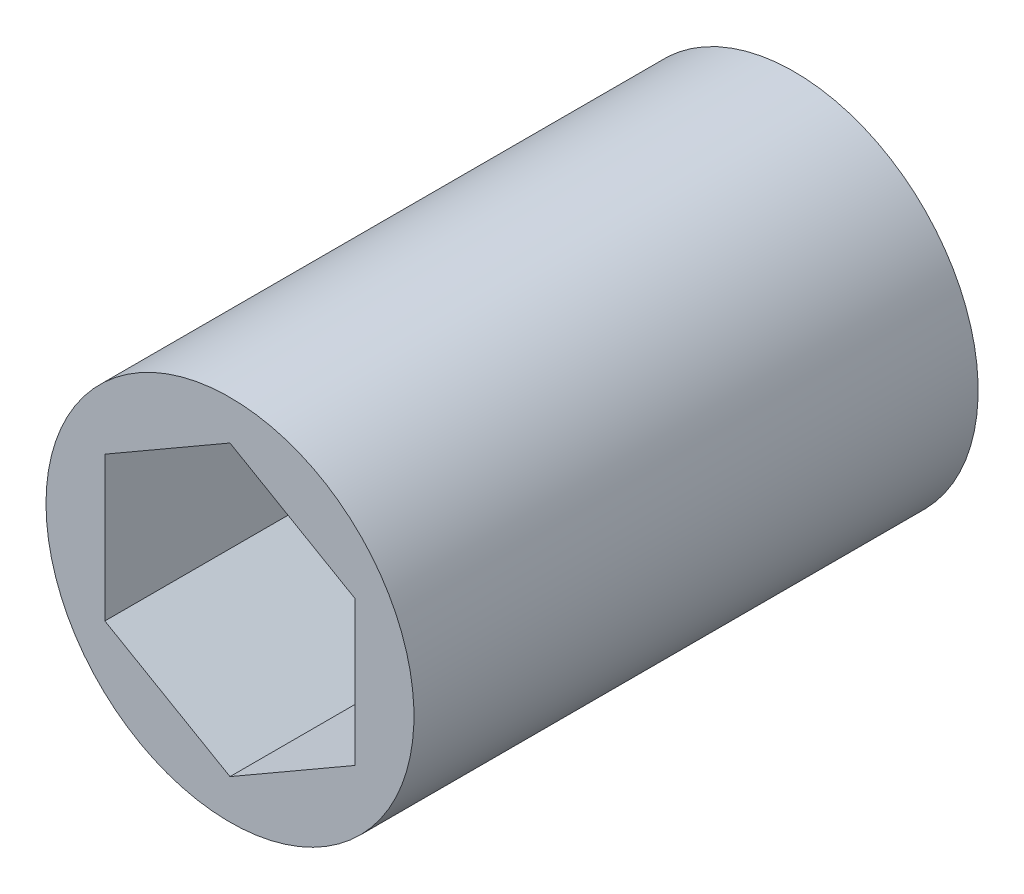
ISO-10303-21;
HEADER;
FILE_DESCRIPTION(('STEP AP214'),'2;1');
FILE_NAME('part.step','',(''),(''),'','','');
FILE_SCHEMA(('AUTOMOTIVE_DESIGN { 1 0 10303 214 1 1 1 1 }'));
ENDSEC;
DATA;
#1=APPLICATION_CONTEXT('core data for automotive mechanical design processes');
#2=APPLICATION_PROTOCOL_DEFINITION('international standard','automotive_design',2000,#1);
#3=PRODUCT_CONTEXT('',#1,'mechanical');
#4=PRODUCT('Part','Part','',(#3));
#5=PRODUCT_RELATED_PRODUCT_CATEGORY('part','',(#4));
#6=PRODUCT_DEFINITION_FORMATION('','',#4);
#7=PRODUCT_DEFINITION_CONTEXT('part definition',#1,'design');
#8=PRODUCT_DEFINITION('design','',#6,#7);
#9=PRODUCT_DEFINITION_SHAPE('','',#8);
#10=(LENGTH_UNIT() NAMED_UNIT(*) SI_UNIT(.MILLI.,.METRE.));
#11=(NAMED_UNIT(*) PLANE_ANGLE_UNIT() SI_UNIT($,.RADIAN.));
#12=(NAMED_UNIT(*) SI_UNIT($,.STERADIAN.) SOLID_ANGLE_UNIT());
#13=UNCERTAINTY_MEASURE_WITH_UNIT(LENGTH_MEASURE(1.E-05),#10,'distance_accuracy_value','');
#14=(GEOMETRIC_REPRESENTATION_CONTEXT(3) GLOBAL_UNCERTAINTY_ASSIGNED_CONTEXT((#13)) GLOBAL_UNIT_ASSIGNED_CONTEXT((#10,
#11,#12)) REPRESENTATION_CONTEXT('',''));
#15=CARTESIAN_POINT('',(0.,0.,0.));
#16=DIRECTION('',(0.,0.,1.));
#17=DIRECTION('',(1.,0.,0.));
#18=AXIS2_PLACEMENT_3D('',#15,#16,#17);
#19=CARTESIAN_POINT('',(0.,0.,14.605));
#20=DIRECTION('',(0.,0.,1.));
#21=DIRECTION('',(1.,0.,0.));
#22=AXIS2_PLACEMENT_3D('',#19,#20,#21);
#23=PLANE('',#22);
#24=CARTESIAN_POINT('',(0.,0.,14.605));
#25=DIRECTION('',(0.,0.,1.));
#26=DIRECTION('',(1.,0.,0.));
#27=AXIS2_PLACEMENT_3D('',#24,#25,#26);
#28=CIRCLE('',#27,9.525);
#29=CARTESIAN_POINT('',(-9.525,0.,14.605));
#30=VERTEX_POINT('',#29);
#31=EDGE_CURVE('E11',#30,#30,#28,.T.);
#32=ORIENTED_EDGE('',*,*,#31,.T.);
#33=EDGE_LOOP('',(#32));
#34=FACE_BOUND('',#33,.T.);
#35=DIRECTION('',(-0.866025403784439,-0.5,0.));
#36=VECTOR('',#35,1.);
#37=CARTESIAN_POINT('',(0.,7.47899538708241,14.605));
#38=LINE('',#37,#36);
#39=CARTESIAN_POINT('',(0.,7.47899538708241,14.605));
#40=VERTEX_POINT('',#39);
#41=CARTESIAN_POINT('',(-6.477,3.73949769354121,14.605));
#42=VERTEX_POINT('',#41);
#43=EDGE_CURVE('E108',#40,#42,#38,.T.);
#44=ORIENTED_EDGE('',*,*,#43,.F.);
#45=DIRECTION('',(-0.866025403784439,0.5,0.));
#46=VECTOR('',#45,1.);
#47=CARTESIAN_POINT('',(6.477,3.73949769354121,14.605));
#48=LINE('',#47,#46);
#49=CARTESIAN_POINT('',(6.477,3.73949769354121,14.605));
#50=VERTEX_POINT('',#49);
#51=EDGE_CURVE('E99',#50,#40,#48,.T.);
#52=ORIENTED_EDGE('',*,*,#51,.F.);
#53=DIRECTION('',(0.,1.,0.));
#54=VECTOR('',#53,1.);
#55=CARTESIAN_POINT('',(6.477,-3.73949769354121,14.605));
#56=LINE('',#55,#54);
#57=CARTESIAN_POINT('',(6.477,-3.73949769354121,14.605));
#58=VERTEX_POINT('',#57);
#59=EDGE_CURVE('E133',#58,#50,#56,.T.);
#60=ORIENTED_EDGE('',*,*,#59,.F.);
#61=DIRECTION('',(0.866025403784439,0.5,0.));
#62=VECTOR('',#61,1.);
#63=CARTESIAN_POINT('',(0.,-7.47899538708241,14.605));
#64=LINE('',#63,#62);
#65=CARTESIAN_POINT('',(0.,-7.47899538708241,14.605));
#66=VERTEX_POINT('',#65);
#67=EDGE_CURVE('E130',#66,#58,#64,.T.);
#68=ORIENTED_EDGE('',*,*,#67,.F.);
#69=DIRECTION('',(0.866025403784439,-0.5,0.));
#70=VECTOR('',#69,1.);
#71=CARTESIAN_POINT('',(-6.477,-3.73949769354121,14.605));
#72=LINE('',#71,#70);
#73=CARTESIAN_POINT('',(-6.477,-3.73949769354121,14.605));
#74=VERTEX_POINT('',#73);
#75=EDGE_CURVE('E125',#74,#66,#72,.T.);
#76=ORIENTED_EDGE('',*,*,#75,.F.);
#77=DIRECTION('',(0.,-1.,0.));
#78=VECTOR('',#77,1.);
#79=CARTESIAN_POINT('',(-6.477,3.73949769354121,14.605));
#80=LINE('',#79,#78);
#81=EDGE_CURVE('E121',#42,#74,#80,.T.);
#82=ORIENTED_EDGE('',*,*,#81,.F.);
#83=EDGE_LOOP('',(#44,#52,#60,#68,#76,#82));
#84=FACE_BOUND('',#83,.T.);
#85=ADVANCED_FACE('F45',(#34,#84),#23,.T.);
#86=CARTESIAN_POINT('',(0.,0.,-14.605));
#87=DIRECTION('',(0.,0.,1.));
#88=DIRECTION('',(1.,0.,0.));
#89=AXIS2_PLACEMENT_3D('',#86,#87,#88);
#90=PLANE('',#89);
#91=CARTESIAN_POINT('',(0.,0.,-14.605));
#92=DIRECTION('',(0.,0.,1.));
#93=DIRECTION('',(1.,0.,0.));
#94=AXIS2_PLACEMENT_3D('',#91,#92,#93);
#95=CIRCLE('',#94,9.525);
#96=CARTESIAN_POINT('',(-9.525,0.,-14.605));
#97=VERTEX_POINT('',#96);
#98=EDGE_CURVE('E49',#97,#97,#95,.T.);
#99=ORIENTED_EDGE('',*,*,#98,.F.);
#100=EDGE_LOOP('',(#99));
#101=FACE_BOUND('',#100,.T.);
#102=DIRECTION('',(-0.866025403784439,0.5,0.));
#103=VECTOR('',#102,1.);
#104=CARTESIAN_POINT('',(6.477,3.73949769354121,-14.605));
#105=LINE('',#104,#103);
#106=CARTESIAN_POINT('',(6.477,3.73949769354121,-14.605));
#107=VERTEX_POINT('',#106);
#108=CARTESIAN_POINT('',(0.,7.47899538708241,-14.605));
#109=VERTEX_POINT('',#108);
#110=EDGE_CURVE('E69',#107,#109,#105,.T.);
#111=ORIENTED_EDGE('',*,*,#110,.T.);
#112=DIRECTION('',(-0.866025403784439,-0.5,0.));
#113=VECTOR('',#112,1.);
#114=CARTESIAN_POINT('',(0.,7.47899538708241,-14.605));
#115=LINE('',#114,#113);
#116=CARTESIAN_POINT('',(-6.477,3.73949769354121,-14.605));
#117=VERTEX_POINT('',#116);
#118=EDGE_CURVE('E115',#109,#117,#115,.T.);
#119=ORIENTED_EDGE('',*,*,#118,.T.);
#120=DIRECTION('',(0.,-1.,0.));
#121=VECTOR('',#120,1.);
#122=CARTESIAN_POINT('',(-6.477,3.73949769354121,-14.605));
#123=LINE('',#122,#121);
#124=CARTESIAN_POINT('',(-6.477,-3.73949769354121,-14.605));
#125=VERTEX_POINT('',#124);
#126=EDGE_CURVE('E140',#117,#125,#123,.T.);
#127=ORIENTED_EDGE('',*,*,#126,.T.);
#128=DIRECTION('',(0.866025403784439,-0.5,0.));
#129=VECTOR('',#128,1.);
#130=CARTESIAN_POINT('',(-6.477,-3.73949769354121,-14.605));
#131=LINE('',#130,#129);
#132=CARTESIAN_POINT('',(0.,-7.47899538708241,-14.605));
#133=VERTEX_POINT('',#132);
#134=EDGE_CURVE('E144',#125,#133,#131,.T.);
#135=ORIENTED_EDGE('',*,*,#134,.T.);
#136=DIRECTION('',(0.866025403784439,0.5,0.));
#137=VECTOR('',#136,1.);
#138=CARTESIAN_POINT('',(0.,-7.47899538708241,-14.605));
#139=LINE('',#138,#137);
#140=CARTESIAN_POINT('',(6.477,-3.73949769354121,-14.605));
#141=VERTEX_POINT('',#140);
#142=EDGE_CURVE('E148',#133,#141,#139,.T.);
#143=ORIENTED_EDGE('',*,*,#142,.T.);
#144=DIRECTION('',(0.,1.,0.));
#145=VECTOR('',#144,1.);
#146=CARTESIAN_POINT('',(6.477,-3.73949769354121,-14.605));
#147=LINE('',#146,#145);
#148=EDGE_CURVE('E109',#141,#107,#147,.T.);
#149=ORIENTED_EDGE('',*,*,#148,.T.);
#150=EDGE_LOOP('',(#111,#119,#127,#135,#143,#149));
#151=FACE_BOUND('',#150,.T.);
#152=ADVANCED_FACE('F172',(#101,#151),#90,.F.);
#153=CARTESIAN_POINT('',(0.,0.,14.605));
#154=DIRECTION('',(0.,0.,-1.));
#155=DIRECTION('',(-1.,0.,0.));
#156=AXIS2_PLACEMENT_3D('',#153,#154,#155);
#157=CYLINDRICAL_SURFACE('',#156,9.525);
#158=CARTESIAN_POINT('',(-9.525,0.,14.605));
#159=CARTESIAN_POINT('',(-9.525,0.,14.3007291666667));
#160=CARTESIAN_POINT('',(-9.525,0.,13.9964583333333));
#161=CARTESIAN_POINT('',(-9.525,0.,13.3879166666667));
#162=CARTESIAN_POINT('',(-9.525,0.,13.0836458333333));
#163=CARTESIAN_POINT('',(-9.525,0.,12.4751041666667));
#164=CARTESIAN_POINT('',(-9.525,0.,12.1708333333333));
#165=CARTESIAN_POINT('',(-9.525,0.,11.5622916666667));
#166=CARTESIAN_POINT('',(-9.525,0.,11.2580208333333));
#167=CARTESIAN_POINT('',(-9.525,0.,10.6494791666667));
#168=CARTESIAN_POINT('',(-9.525,0.,10.3452083333333));
#169=CARTESIAN_POINT('',(-9.525,0.,9.73666666666666));
#170=CARTESIAN_POINT('',(-9.525,0.,9.43239583333333));
#171=CARTESIAN_POINT('',(-9.525,0.,8.82385416666666));
#172=CARTESIAN_POINT('',(-9.525,0.,8.51958333333333));
#173=CARTESIAN_POINT('',(-9.525,0.,7.91104166666666));
#174=CARTESIAN_POINT('',(-9.525,0.,7.60677083333333));
#175=CARTESIAN_POINT('',(-9.525,0.,6.99822916666666));
#176=CARTESIAN_POINT('',(-9.525,0.,6.69395833333333));
#177=CARTESIAN_POINT('',(-9.525,0.,6.08541666666666));
#178=CARTESIAN_POINT('',(-9.525,0.,5.78114583333333));
#179=CARTESIAN_POINT('',(-9.525,0.,5.17260416666667));
#180=CARTESIAN_POINT('',(-9.525,0.,4.86833333333333));
#181=CARTESIAN_POINT('',(-9.525,0.,4.25979166666666));
#182=CARTESIAN_POINT('',(-9.525,0.,3.95552083333333));
#183=CARTESIAN_POINT('',(-9.525,0.,3.34697916666666));
#184=CARTESIAN_POINT('',(-9.525,0.,3.04270833333333));
#185=CARTESIAN_POINT('',(-9.525,0.,2.43416666666667));
#186=CARTESIAN_POINT('',(-9.525,0.,2.12989583333333));
#187=CARTESIAN_POINT('',(-9.525,0.,1.52135416666667));
#188=CARTESIAN_POINT('',(-9.525,0.,1.21708333333333));
#189=CARTESIAN_POINT('',(-9.525,0.,0.608541666666665));
#190=CARTESIAN_POINT('',(-9.525,0.,0.304270833333332));
#191=CARTESIAN_POINT('',(-9.525,0.,-0.304270833333335));
#192=CARTESIAN_POINT('',(-9.525,0.,-0.608541666666669));
#193=CARTESIAN_POINT('',(-9.525,0.,-1.21708333333333));
#194=CARTESIAN_POINT('',(-9.525,0.,-1.52135416666667));
#195=CARTESIAN_POINT('',(-9.525,0.,-2.12989583333333));
#196=CARTESIAN_POINT('',(-9.525,0.,-2.43416666666666));
#197=CARTESIAN_POINT('',(-9.525,0.,-3.04270833333333));
#198=CARTESIAN_POINT('',(-9.525,0.,-3.34697916666667));
#199=CARTESIAN_POINT('',(-9.525,0.,-3.95552083333333));
#200=CARTESIAN_POINT('',(-9.525,0.,-4.25979166666667));
#201=CARTESIAN_POINT('',(-9.525,0.,-4.86833333333333));
#202=CARTESIAN_POINT('',(-9.525,0.,-5.17260416666667));
#203=CARTESIAN_POINT('',(-9.525,0.,-5.78114583333333));
#204=CARTESIAN_POINT('',(-9.525,0.,-6.08541666666667));
#205=CARTESIAN_POINT('',(-9.525,0.,-6.69395833333333));
#206=CARTESIAN_POINT('',(-9.525,0.,-6.99822916666667));
#207=CARTESIAN_POINT('',(-9.525,0.,-7.60677083333333));
#208=CARTESIAN_POINT('',(-9.525,0.,-7.91104166666666));
#209=CARTESIAN_POINT('',(-9.525,0.,-8.51958333333333));
#210=CARTESIAN_POINT('',(-9.525,0.,-8.82385416666667));
#211=CARTESIAN_POINT('',(-9.525,0.,-9.43239583333333));
#212=CARTESIAN_POINT('',(-9.525,0.,-9.73666666666666));
#213=CARTESIAN_POINT('',(-9.525,0.,-10.3452083333333));
#214=CARTESIAN_POINT('',(-9.525,0.,-10.6494791666667));
#215=CARTESIAN_POINT('',(-9.525,0.,-11.2580208333333));
#216=CARTESIAN_POINT('',(-9.525,0.,-11.5622916666667));
#217=CARTESIAN_POINT('',(-9.525,0.,-12.1708333333333));
#218=CARTESIAN_POINT('',(-9.525,0.,-12.4751041666667));
#219=CARTESIAN_POINT('',(-9.525,0.,-13.0836458333333));
#220=CARTESIAN_POINT('',(-9.525,0.,-13.3879166666667));
#221=CARTESIAN_POINT('',(-9.525,0.,-13.9964583333333));
#222=CARTESIAN_POINT('',(-9.525,0.,-14.3007291666667));
#223=CARTESIAN_POINT('',(-9.525,0.,-14.605));
#224=B_SPLINE_CURVE_WITH_KNOTS('',3,(#158,#159,#160,#161,#162,#163,#164,#165,#166,#167,#168,
#169,#170,#171,#172,#173,#174,#175,#176,#177,#178,#179,#180,#181,#182,#183,#184,#185,#186,#187,
#188,#189,#190,#191,#192,#193,#194,#195,#196,#197,#198,#199,#200,#201,#202,#203,#204,#205,#206,
#207,#208,#209,#210,#211,#212,#213,#214,#215,#216,#217,#218,#219,#220,#221,#222,#223),
.UNSPECIFIED.,.F.,.F.,(4,2,2,2,2,2,2,2,2,2,2,2,2,2,2,2,2,2,2,2,2,2,2,2,2,2,2,2,2,2,2,2,4),(0.,
0.912812499999999,1.825625,2.7384375,3.65125,4.5640625,5.476875,6.3896875,7.3025,8.2153125,
9.128125,10.0409375,10.95375,11.8665625,12.779375,13.6921875,14.605,15.5178125,16.430625,
17.3434375,18.25625,19.1690625,20.081875,20.9946875,21.9075,22.8203125,23.733125,24.6459375,
25.55875,26.4715625,27.384375,28.2971875,29.21),.UNSPECIFIED.);
#225=EDGE_CURVE('BSEAM47',#30,#97,#224,.T.);
#226=ORIENTED_EDGE('',*,*,#31,.F.);
#227=ORIENTED_EDGE('',*,*,#98,.T.);
#228=ORIENTED_EDGE('',*,*,#225,.T.);
#229=ORIENTED_EDGE('',*,*,#225,.F.);
#230=EDGE_LOOP('',(#226,#228,#227,#229));
#231=FACE_BOUND('',#230,.T.);
#232=ADVANCED_FACE('F47',(#231),#157,.T.);
#233=CARTESIAN_POINT('',(6.477,3.73949769354121,14.605));
#234=DIRECTION('',(-0.5,-0.866025403784439,0.));
#235=DIRECTION('',(0.866025403784439,-0.5,0.));
#236=AXIS2_PLACEMENT_3D('',#233,#234,#235);
#237=PLANE('',#236);
#238=ORIENTED_EDGE('',*,*,#110,.F.);
#239=DIRECTION('',(0.,0.,-1.));
#240=VECTOR('',#239,1.);
#241=CARTESIAN_POINT('',(6.477,3.73949769354121,14.605));
#242=LINE('',#241,#240);
#243=EDGE_CURVE('E103',#50,#107,#242,.T.);
#244=ORIENTED_EDGE('',*,*,#243,.F.);
#245=ORIENTED_EDGE('',*,*,#51,.T.);
#246=DIRECTION('',(0.,0.,-1.));
#247=VECTOR('',#246,1.);
#248=CARTESIAN_POINT('',(0.,7.47899538708241,14.605));
#249=LINE('',#248,#247);
#250=EDGE_CURVE('E102',#40,#109,#249,.T.);
#251=ORIENTED_EDGE('',*,*,#250,.T.);
#252=EDGE_LOOP('',(#238,#244,#245,#251));
#253=FACE_BOUND('',#252,.T.);
#254=ADVANCED_FACE('F101',(#253),#237,.T.);
#255=CARTESIAN_POINT('',(0.,7.47899538708241,14.605));
#256=DIRECTION('',(0.5,-0.866025403784439,0.));
#257=DIRECTION('',(0.866025403784439,0.5,0.));
#258=AXIS2_PLACEMENT_3D('',#255,#256,#257);
#259=PLANE('',#258);
#260=ORIENTED_EDGE('',*,*,#118,.F.);
#261=ORIENTED_EDGE('',*,*,#250,.F.);
#262=ORIENTED_EDGE('',*,*,#43,.T.);
#263=DIRECTION('',(0.,0.,-1.));
#264=VECTOR('',#263,1.);
#265=CARTESIAN_POINT('',(-6.477,3.73949769354121,14.605));
#266=LINE('',#265,#264);
#267=EDGE_CURVE('E117',#42,#117,#266,.T.);
#268=ORIENTED_EDGE('',*,*,#267,.T.);
#269=EDGE_LOOP('',(#260,#261,#262,#268));
#270=FACE_BOUND('',#269,.T.);
#271=ADVANCED_FACE('F112',(#270),#259,.T.);
#272=CARTESIAN_POINT('',(-6.477,3.73949769354121,14.605));
#273=DIRECTION('',(1.,0.,0.));
#274=DIRECTION('',(0.,1.,0.));
#275=AXIS2_PLACEMENT_3D('',#272,#273,#274);
#276=PLANE('',#275);
#277=ORIENTED_EDGE('',*,*,#126,.F.);
#278=ORIENTED_EDGE('',*,*,#267,.F.);
#279=ORIENTED_EDGE('',*,*,#81,.T.);
#280=DIRECTION('',(0.,0.,-1.));
#281=VECTOR('',#280,1.);
#282=CARTESIAN_POINT('',(-6.477,-3.73949769354121,14.605));
#283=LINE('',#282,#281);
#284=EDGE_CURVE('E162',#74,#125,#283,.T.);
#285=ORIENTED_EDGE('',*,*,#284,.T.);
#286=EDGE_LOOP('',(#277,#278,#279,#285));
#287=FACE_BOUND('',#286,.T.);
#288=ADVANCED_FACE('F168',(#287),#276,.T.);
#289=CARTESIAN_POINT('',(-6.477,-3.73949769354121,14.605));
#290=DIRECTION('',(0.5,0.866025403784439,0.));
#291=DIRECTION('',(-0.866025403784439,0.5,0.));
#292=AXIS2_PLACEMENT_3D('',#289,#290,#291);
#293=PLANE('',#292);
#294=ORIENTED_EDGE('',*,*,#134,.F.);
#295=ORIENTED_EDGE('',*,*,#284,.F.);
#296=ORIENTED_EDGE('',*,*,#75,.T.);
#297=DIRECTION('',(0.,0.,-1.));
#298=VECTOR('',#297,1.);
#299=CARTESIAN_POINT('',(0.,-7.47899538708241,14.605));
#300=LINE('',#299,#298);
#301=EDGE_CURVE('E159',#66,#133,#300,.T.);
#302=ORIENTED_EDGE('',*,*,#301,.T.);
#303=EDGE_LOOP('',(#294,#295,#296,#302));
#304=FACE_BOUND('',#303,.T.);
#305=ADVANCED_FACE('F180',(#304),#293,.T.);
#306=CARTESIAN_POINT('',(0.,-7.47899538708241,14.605));
#307=DIRECTION('',(-0.5,0.866025403784439,0.));
#308=DIRECTION('',(-0.866025403784439,-0.5,0.));
#309=AXIS2_PLACEMENT_3D('',#306,#307,#308);
#310=PLANE('',#309);
#311=ORIENTED_EDGE('',*,*,#142,.F.);
#312=ORIENTED_EDGE('',*,*,#301,.F.);
#313=ORIENTED_EDGE('',*,*,#67,.T.);
#314=DIRECTION('',(0.,0.,-1.));
#315=VECTOR('',#314,1.);
#316=CARTESIAN_POINT('',(6.477,-3.73949769354121,14.605));
#317=LINE('',#316,#315);
#318=EDGE_CURVE('E61',#58,#141,#317,.T.);
#319=ORIENTED_EDGE('',*,*,#318,.T.);
#320=EDGE_LOOP('',(#311,#312,#313,#319));
#321=FACE_BOUND('',#320,.T.);
#322=ADVANCED_FACE('F178',(#321),#310,.T.);
#323=CARTESIAN_POINT('',(6.477,-3.73949769354121,14.605));
#324=DIRECTION('',(-1.,0.,0.));
#325=DIRECTION('',(0.,0.,1.));
#326=AXIS2_PLACEMENT_3D('',#323,#324,#325);
#327=PLANE('',#326);
#328=ORIENTED_EDGE('',*,*,#148,.F.);
#329=ORIENTED_EDGE('',*,*,#318,.F.);
#330=ORIENTED_EDGE('',*,*,#59,.T.);
#331=ORIENTED_EDGE('',*,*,#243,.T.);
#332=EDGE_LOOP('',(#328,#329,#330,#331));
#333=FACE_BOUND('',#332,.T.);
#334=ADVANCED_FACE('F174',(#333),#327,.T.);
#335=CLOSED_SHELL('',(#85,#152,#232,#254,#271,#288,#305,#322,#334));
#336=MANIFOLD_SOLID_BREP('B2',#335);
#337=ADVANCED_BREP_SHAPE_REPRESENTATION('',(#18,#336),#14);
#338=SHAPE_DEFINITION_REPRESENTATION(#9,#337);
ENDSEC;
END-ISO-10303-21;
